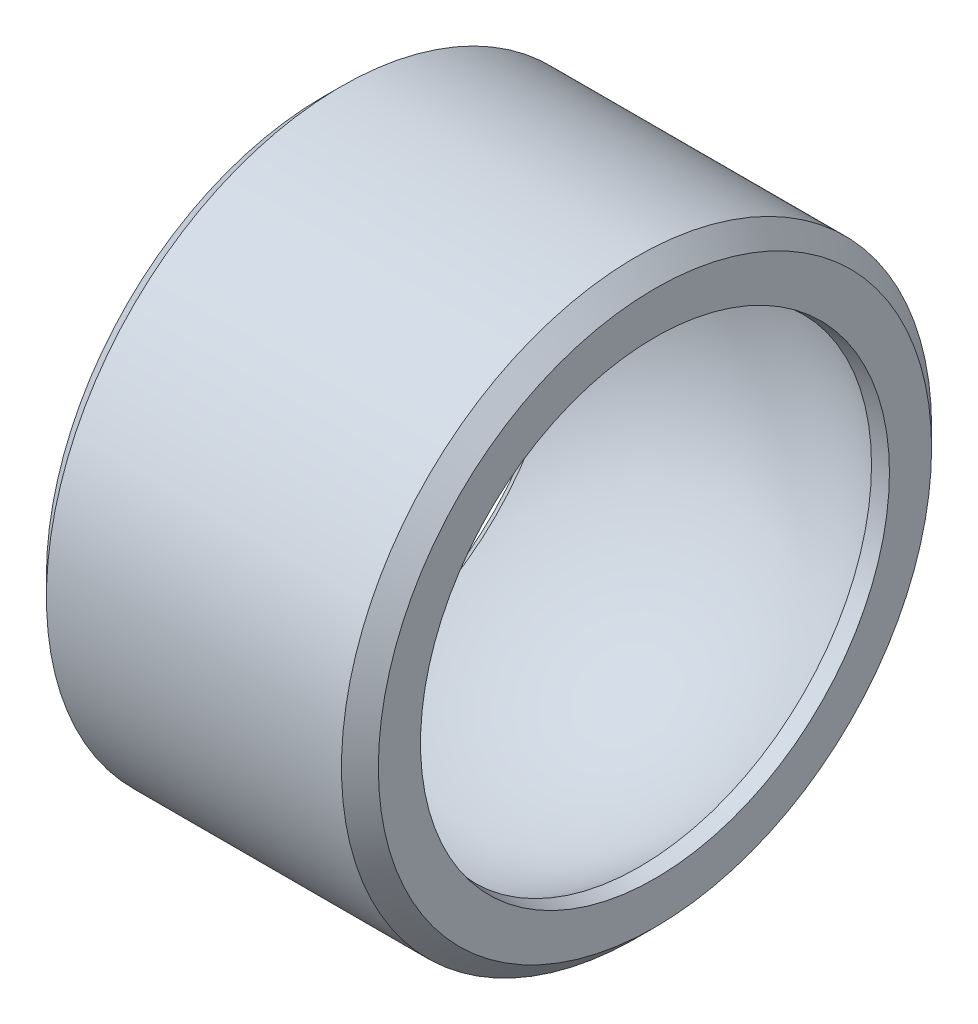
ISO-10303-21;
HEADER;
FILE_DESCRIPTION(('STEP AP214'),'2;1');
FILE_NAME('part.step','',(''),(''),'','','');
FILE_SCHEMA(('AUTOMOTIVE_DESIGN { 1 0 10303 214 1 1 1 1 }'));
ENDSEC;
DATA;
#1=APPLICATION_CONTEXT('core data for automotive mechanical design processes');
#2=APPLICATION_PROTOCOL_DEFINITION('international standard','automotive_design',2000,#1);
#3=PRODUCT_CONTEXT('',#1,'mechanical');
#4=PRODUCT('Part','Part','',(#3));
#5=PRODUCT_RELATED_PRODUCT_CATEGORY('part','',(#4));
#6=PRODUCT_DEFINITION_FORMATION('','',#4);
#7=PRODUCT_DEFINITION_CONTEXT('part definition',#1,'design');
#8=PRODUCT_DEFINITION('design','',#6,#7);
#9=PRODUCT_DEFINITION_SHAPE('','',#8);
#10=(LENGTH_UNIT() NAMED_UNIT(*) SI_UNIT(.MILLI.,.METRE.));
#11=(NAMED_UNIT(*) PLANE_ANGLE_UNIT() SI_UNIT($,.RADIAN.));
#12=(NAMED_UNIT(*) SI_UNIT($,.STERADIAN.) SOLID_ANGLE_UNIT());
#13=UNCERTAINTY_MEASURE_WITH_UNIT(LENGTH_MEASURE(1.E-05),#10,'distance_accuracy_value','');
#14=(GEOMETRIC_REPRESENTATION_CONTEXT(3) GLOBAL_UNCERTAINTY_ASSIGNED_CONTEXT((#13)) GLOBAL_UNIT_ASSIGNED_CONTEXT((#10,
#11,#12)) REPRESENTATION_CONTEXT('',''));
#15=CARTESIAN_POINT('',(0.,0.,0.));
#16=DIRECTION('',(0.,0.,1.));
#17=DIRECTION('',(1.,0.,0.));
#18=AXIS2_PLACEMENT_3D('',#15,#16,#17);
#19=CARTESIAN_POINT('',(9.,0.,0.));
#20=DIRECTION('',(-1.,0.,0.));
#21=DIRECTION('',(0.,0.,1.));
#22=AXIS2_PLACEMENT_3D('',#19,#20,#21);
#23=CYLINDRICAL_SURFACE('',#22,8.);
#24=CARTESIAN_POINT('',(8.5,0.,0.));
#25=DIRECTION('',(1.,0.,0.));
#26=DIRECTION('',(0.,0.,-1.));
#27=AXIS2_PLACEMENT_3D('',#24,#25,#26);
#28=CIRCLE('',#27,8.);
#29=CARTESIAN_POINT('',(8.5,0.,-8.));
#30=VERTEX_POINT('',#29);
#31=EDGE_CURVE('E37',#30,#30,#28,.F.);
#32=ORIENTED_EDGE('',*,*,#31,.T.);
#33=EDGE_LOOP('',(#32));
#34=FACE_BOUND('',#33,.T.);
#35=CARTESIAN_POINT('',(0.5,0.,0.));
#36=DIRECTION('',(1.,0.,0.));
#37=DIRECTION('',(0.,0.,-1.));
#38=AXIS2_PLACEMENT_3D('',#35,#36,#37);
#39=CIRCLE('',#38,8.);
#40=CARTESIAN_POINT('',(0.5,0.,-8.));
#41=VERTEX_POINT('',#40);
#42=EDGE_CURVE('E41',#41,#41,#39,.T.);
#43=ORIENTED_EDGE('',*,*,#42,.T.);
#44=EDGE_LOOP('',(#43));
#45=FACE_BOUND('',#44,.T.);
#46=ADVANCED_FACE('F30',(#34,#45),#23,.T.);
#47=CARTESIAN_POINT('',(9.,0.,0.));
#48=DIRECTION('',(1.,0.,0.));
#49=DIRECTION('',(0.,0.,-1.));
#50=AXIS2_PLACEMENT_3D('',#47,#48,#49);
#51=PLANE('',#50);
#52=CARTESIAN_POINT('',(9.,0.,0.));
#53=DIRECTION('',(1.,0.,0.));
#54=DIRECTION('',(0.,0.,-1.));
#55=AXIS2_PLACEMENT_3D('',#52,#53,#54);
#56=CIRCLE('',#55,7.5);
#57=CARTESIAN_POINT('',(9.,0.,-7.5));
#58=VERTEX_POINT('',#57);
#59=EDGE_CURVE('E45',#58,#58,#56,.T.);
#60=ORIENTED_EDGE('',*,*,#59,.T.);
#61=EDGE_LOOP('',(#60));
#62=FACE_BOUND('',#61,.T.);
#63=CARTESIAN_POINT('',(9.,0.,0.));
#64=DIRECTION('',(1.,0.,0.));
#65=DIRECTION('',(0.,0.,-1.));
#66=AXIS2_PLACEMENT_3D('',#63,#64,#65);
#67=CIRCLE('',#66,6.35714285714286);
#68=CARTESIAN_POINT('',(9.,0.,-6.35714285714286));
#69=VERTEX_POINT('',#68);
#70=EDGE_CURVE('E59',#69,#69,#67,.F.);
#71=ORIENTED_EDGE('',*,*,#70,.T.);
#72=EDGE_LOOP('',(#71));
#73=FACE_BOUND('',#72,.T.);
#74=ADVANCED_FACE('F63',(#62,#73),#51,.T.);
#75=CARTESIAN_POINT('',(0.,0.,0.));
#76=DIRECTION('',(1.,0.,0.));
#77=DIRECTION('',(0.,0.,-1.));
#78=AXIS2_PLACEMENT_3D('',#75,#76,#77);
#79=PLANE('',#78);
#80=CARTESIAN_POINT('',(0.,0.,0.));
#81=DIRECTION('',(1.,0.,0.));
#82=DIRECTION('',(0.,0.,-1.));
#83=AXIS2_PLACEMENT_3D('',#80,#81,#82);
#84=CIRCLE('',#83,7.5);
#85=CARTESIAN_POINT('',(0.,0.,-7.5));
#86=VERTEX_POINT('',#85);
#87=EDGE_CURVE('E10',#86,#86,#84,.F.);
#88=ORIENTED_EDGE('',*,*,#87,.T.);
#89=EDGE_LOOP('',(#88));
#90=FACE_BOUND('',#89,.T.);
#91=CARTESIAN_POINT('',(0.,0.,0.));
#92=DIRECTION('',(1.,0.,0.));
#93=DIRECTION('',(0.,0.,-1.));
#94=AXIS2_PLACEMENT_3D('',#91,#92,#93);
#95=CIRCLE('',#94,6.50000000000001);
#96=CARTESIAN_POINT('',(0.,0.,-6.50000000000001));
#97=VERTEX_POINT('',#96);
#98=EDGE_CURVE('E50',#97,#97,#95,.T.);
#99=ORIENTED_EDGE('',*,*,#98,.T.);
#100=EDGE_LOOP('',(#99));
#101=FACE_BOUND('',#100,.T.);
#102=ADVANCED_FACE('F78',(#90,#101),#79,.F.);
#103=CARTESIAN_POINT('',(4.5,0.,0.));
#104=DIRECTION('',(-1.,0.,0.));
#105=DIRECTION('',(0.,1.,0.));
#106=AXIS2_PLACEMENT_3D('',#103,#104,#105);
#107=SPHERICAL_SURFACE('',#106,7.5);
#108=CARTESIAN_POINT('',(8.57493589701444,0.,0.));
#109=DIRECTION('',(-1.,0.,0.));
#110=DIRECTION('',(0.,0.,1.));
#111=AXIS2_PLACEMENT_3D('',#108,#109,#110);
#112=CIRCLE('',#111,6.29641941385921);
#113=CARTESIAN_POINT('',(8.57493589701445,6.2964194138592,0.));
#114=VERTEX_POINT('',#113);
#115=EDGE_CURVE('E53',#114,#114,#112,.F.);
#116=CARTESIAN_POINT('',(0.291833336000093,0.,0.));
#117=DIRECTION('',(1.,0.,0.));
#118=DIRECTION('',(0.,0.,-1.));
#119=AXIS2_PLACEMENT_3D('',#116,#117,#118);
#120=CIRCLE('',#119,6.20816666399992);
#121=CARTESIAN_POINT('',(0.291833336000092,6.20816666399992,0.));
#122=VERTEX_POINT('',#121);
#123=EDGE_CURVE('E56',#122,#122,#120,.F.);
#124=CARTESIAN_POINT('',(8.57493589701445,6.2964194138592,0.));
#125=CARTESIAN_POINT('',(8.49819259282971,6.34608733446691,0.));
#126=CARTESIAN_POINT('',(8.4205404241408,6.39435082238189,0.));
#127=CARTESIAN_POINT('',(8.26352397458615,6.48800743673422,0.));
#128=CARTESIAN_POINT('',(8.18415969372041,6.53340056317157,0.));
#129=CARTESIAN_POINT('',(8.02382463664363,6.62125495847651,0.));
#130=CARTESIAN_POINT('',(7.94285386043258,6.66371622734409,0.));
#131=CARTESIAN_POINT('',(7.7794141904943,6.74565035916877,0.));
#132=CARTESIAN_POINT('',(7.69694529676706,6.78512322212586,0.));
#133=CARTESIAN_POINT('',(7.53061960809427,6.86102771342148,0.));
#134=CARTESIAN_POINT('',(7.4467628131487,6.89745934176,0.));
#135=CARTESIAN_POINT('',(7.27777343782805,6.96723267469868,0.));
#136=CARTESIAN_POINT('',(7.19264085745296,7.00057437929882,0.));
#137=CARTESIAN_POINT('',(7.02121372083556,7.06412328671802,0.));
#138=CARTESIAN_POINT('',(6.93491916459325,7.09433048953708,0.));
#139=CARTESIAN_POINT('',(6.7612834423876,7.15157001110472,0.));
#140=CARTESIAN_POINT('',(6.67394227642427,7.17860232985332,0.));
#141=CARTESIAN_POINT('',(6.49833009926744,7.22945594400995,0.));
#142=CARTESIAN_POINT('',(6.41005908807394,7.25327723941799,0.));
#143=CARTESIAN_POINT('',(6.23270522826621,7.29767696075729,0.));
#144=CARTESIAN_POINT('',(6.14362237965198,7.31825538668855,0.));
#145=CARTESIAN_POINT('',(5.96476393808075,7.35614185816386,0.));
#146=CARTESIAN_POINT('',(5.87498834512374,7.37344990370792,0.));
#147=CARTESIAN_POINT('',(5.69486443407734,7.40477247563232,0.));
#148=CARTESIAN_POINT('',(5.60451611598795,7.41878700201266,0.));
#149=CARTESIAN_POINT('',(5.42336753954767,7.44350379986615,0.));
#150=CARTESIAN_POINT('',(5.33256728119678,7.4542060713393,0.));
#151=CARTESIAN_POINT('',(5.1506362132955,7.47228405172466,0.));
#152=CARTESIAN_POINT('',(5.05950540374512,7.47965976063688,0.));
#153=CARTESIAN_POINT('',(4.87703506441389,7.49107475546154,0.));
#154=CARTESIAN_POINT('',(4.78569553463305,7.49511404137398,0.));
#155=CARTESIAN_POINT('',(4.60292986484394,7.49985079015801,0.));
#156=CARTESIAN_POINT('',(4.51150372483568,7.50054825302961,0.));
#157=CARTESIAN_POINT('',(4.32868706038226,7.49860042330768,0.));
#158=CARTESIAN_POINT('',(4.23729653593709,7.49595513071416,0.));
#159=CARTESIAN_POINT('',(4.05467328078664,7.48732532650113,0.));
#160=CARTESIAN_POINT('',(3.96344055008135,7.48134081488163,0.));
#161=CARTESIAN_POINT('',(3.78125484963612,7.46604057319132,0.));
#162=CARTESIAN_POINT('',(3.69030187989618,7.45672484312051,0.));
#163=CARTESIAN_POINT('',(3.50879729460018,7.43477461854219,0.));
#164=CARTESIAN_POINT('',(3.41824567904412,7.42214012403467,0.));
#165=CARTESIAN_POINT('',(3.23766485877227,7.39356926138727,0.));
#166=CARTESIAN_POINT('',(3.14763565405648,7.37763289324738,0.));
#167=CARTESIAN_POINT('',(2.96822001371971,7.34247958835076,0.));
#168=CARTESIAN_POINT('',(2.87883357809872,7.32326265159403,0.));
#169=CARTESIAN_POINT('',(2.70082297490534,7.28157390019907,0.));
#170=CARTESIAN_POINT('',(2.61219880733295,7.25910208556084,0.));
#171=CARTESIAN_POINT('',(2.4358312201127,7.21093362054676,0.));
#172=CARTESIAN_POINT('',(2.34808780046483,7.18523697017091,0.));
#173=CARTESIAN_POINT('',(2.1735990115781,7.13065318694366,0.));
#174=CARTESIAN_POINT('',(2.08685364233925,7.10176605409228,0.));
#175=CARTESIAN_POINT('',(1.91447692224623,7.0408399248443,0.));
#176=CARTESIAN_POINT('',(1.82884557139206,7.00880092844772,0.));
#177=CARTESIAN_POINT('',(1.65881136761225,6.94161390330165,0.));
#178=CARTESIAN_POINT('',(1.57440851468659,6.90646587455217,0.));
#179=CARTESIAN_POINT('',(1.40694414067945,6.83310777752782,0.));
#180=CARTESIAN_POINT('',(1.32388261959797,6.79489770925296,0.));
#181=CARTESIAN_POINT('',(1.15921196221244,6.71546660006051,0.));
#182=CARTESIAN_POINT('',(1.07760282590839,6.67424555914291,0.));
#183=CARTESIAN_POINT('',(0.915946003750325,6.5888476697243,0.));
#184=CARTESIAN_POINT('',(0.835898317896313,6.54467082122327,0.));
#185=CARTESIAN_POINT('',(0.677471545006516,6.45342016131368,0.));
#186=CARTESIAN_POINT('',(0.599092457970731,6.4063463499051,0.));
#187=CARTESIAN_POINT('',(0.444107165294566,6.30936549665679,0.));
#188=CARTESIAN_POINT('',(0.367500959654184,6.25945845481705,0.));
#189=CARTESIAN_POINT('',(0.291833336000092,6.20816666399992,0.));
#190=B_SPLINE_CURVE_WITH_KNOTS('',3,(#124,#125,#126,#127,#128,#129,#130,#131,#132,#133,#134,
#135,#136,#137,#138,#139,#140,#141,#142,#143,#144,#145,#146,#147,#148,#149,#150,#151,#152,#153,
#154,#155,#156,#157,#158,#159,#160,#161,#162,#163,#164,#165,#166,#167,#168,#169,#170,#171,#172,
#173,#174,#175,#176,#177,#178,#179,#180,#181,#182,#183,#184,#185,#186,#187,#188,#189),
.UNSPECIFIED.,.F.,.F.,(4,2,2,2,2,2,2,2,2,2,2,2,2,2,2,2,2,2,2,2,2,2,2,2,2,2,2,2,2,2,2,2,4),(0.,
0.274225286340827,0.548450572681653,0.82267585902248,1.0969011453633,1.37112643170413,
1.64535171804496,1.91957700438578,2.19380229072661,2.46802757706744,2.74225286340826,
3.01647814974909,3.29070343608991,3.56492872243074,3.83915400877157,4.11337929511239,
4.38760458145322,4.66182986779405,4.93605515413487,5.2102804404757,5.48450572681652,
5.75873101315735,6.03295629949817,6.307181585839,6.58140687217983,6.85563215852065,
7.12985744486148,7.40408273120231,7.67830801754313,7.95253330388396,8.22675859022478,
8.50098387656561,8.77520916290644),.UNSPECIFIED.);
#191=EDGE_CURVE('BSEAM68',#114,#122,#190,.T.);
#192=ORIENTED_EDGE('',*,*,#115,.T.);
#193=ORIENTED_EDGE('',*,*,#123,.T.);
#194=ORIENTED_EDGE('',*,*,#191,.T.);
#195=ORIENTED_EDGE('',*,*,#191,.F.);
#196=EDGE_LOOP('',(#192,#194,#193,#195));
#197=FACE_BOUND('',#196,.T.);
#198=ADVANCED_FACE('F68',(#197),#107,.F.);
#199=CARTESIAN_POINT('',(9.,0.,0.));
#200=DIRECTION('',(1.,0.,0.));
#201=DIRECTION('',(0.,0.,-1.));
#202=AXIS2_PLACEMENT_3D('',#199,#200,#201);
#203=CONICAL_SURFACE('',#202,6.35714285714286,0.141897054604165);
#204=ORIENTED_EDGE('',*,*,#115,.F.);
#205=EDGE_LOOP('',(#204));
#206=FACE_BOUND('',#205,.T.);
#207=ORIENTED_EDGE('',*,*,#70,.F.);
#208=EDGE_LOOP('',(#207));
#209=FACE_BOUND('',#208,.T.);
#210=ADVANCED_FACE('F65',(#206,#209),#203,.F.);
#211=CARTESIAN_POINT('',(0.291833336000093,0.,0.));
#212=DIRECTION('',(-1.,0.,0.));
#213=DIRECTION('',(0.,0.,1.));
#214=AXIS2_PLACEMENT_3D('',#211,#212,#213);
#215=CONICAL_SURFACE('',#214,6.20816666399992,0.785398163397447);
#216=ORIENTED_EDGE('',*,*,#98,.F.);
#217=EDGE_LOOP('',(#216));
#218=FACE_BOUND('',#217,.T.);
#219=ORIENTED_EDGE('',*,*,#123,.F.);
#220=EDGE_LOOP('',(#219));
#221=FACE_BOUND('',#220,.T.);
#222=ADVANCED_FACE('F67',(#218,#221),#215,.F.);
#223=CARTESIAN_POINT('',(9.,0.,0.));
#224=DIRECTION('',(-1.,0.,0.));
#225=DIRECTION('',(0.,0.,1.));
#226=AXIS2_PLACEMENT_3D('',#223,#224,#225);
#227=CONICAL_SURFACE('',#226,7.5,0.78539816339745);
#228=ORIENTED_EDGE('',*,*,#31,.F.);
#229=EDGE_LOOP('',(#228));
#230=FACE_BOUND('',#229,.T.);
#231=ORIENTED_EDGE('',*,*,#59,.F.);
#232=EDGE_LOOP('',(#231));
#233=FACE_BOUND('',#232,.T.);
#234=ADVANCED_FACE('F75',(#230,#233),#227,.T.);
#235=CARTESIAN_POINT('',(0.5,0.,0.));
#236=DIRECTION('',(1.,0.,0.));
#237=DIRECTION('',(0.,0.,-1.));
#238=AXIS2_PLACEMENT_3D('',#235,#236,#237);
#239=CONICAL_SURFACE('',#238,8.,0.785398163397452);
#240=ORIENTED_EDGE('',*,*,#87,.F.);
#241=EDGE_LOOP('',(#240));
#242=FACE_BOUND('',#241,.T.);
#243=ORIENTED_EDGE('',*,*,#42,.F.);
#244=EDGE_LOOP('',(#243));
#245=FACE_BOUND('',#244,.T.);
#246=ADVANCED_FACE('F32',(#242,#245),#239,.T.);
#247=CLOSED_SHELL('',(#46,#74,#102,#198,#210,#222,#234,#246));
#248=MANIFOLD_SOLID_BREP('B2',#247);
#249=ADVANCED_BREP_SHAPE_REPRESENTATION('',(#18,#248),#14);
#250=SHAPE_DEFINITION_REPRESENTATION(#9,#249);
ENDSEC;
END-ISO-10303-21;
